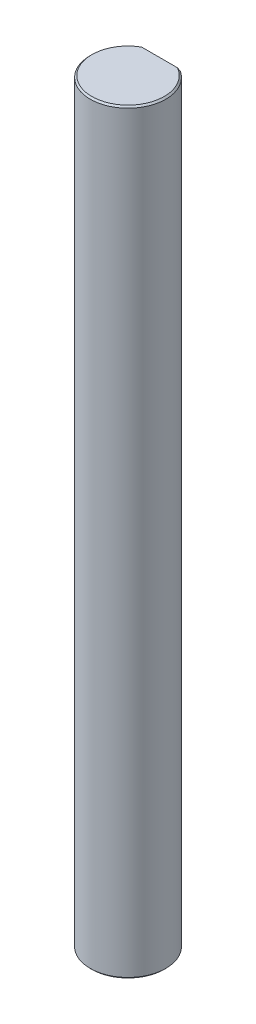
ISO-10303-21;
HEADER;
FILE_DESCRIPTION(('STEP AP214'),'2;1');
FILE_NAME('part.step','',(''),(''),'','','');
FILE_SCHEMA(('AUTOMOTIVE_DESIGN { 1 0 10303 214 1 1 1 1 }'));
ENDSEC;
DATA;
#1=APPLICATION_CONTEXT('core data for automotive mechanical design processes');
#2=APPLICATION_PROTOCOL_DEFINITION('international standard','automotive_design',2000,#1);
#3=PRODUCT_CONTEXT('',#1,'mechanical');
#4=PRODUCT('Part','Part','',(#3));
#5=PRODUCT_RELATED_PRODUCT_CATEGORY('part','',(#4));
#6=PRODUCT_DEFINITION_FORMATION('','',#4);
#7=PRODUCT_DEFINITION_CONTEXT('part definition',#1,'design');
#8=PRODUCT_DEFINITION('design','',#6,#7);
#9=PRODUCT_DEFINITION_SHAPE('','',#8);
#10=(LENGTH_UNIT() NAMED_UNIT(*) SI_UNIT(.MILLI.,.METRE.));
#11=(NAMED_UNIT(*) PLANE_ANGLE_UNIT() SI_UNIT($,.RADIAN.));
#12=(NAMED_UNIT(*) SI_UNIT($,.STERADIAN.) SOLID_ANGLE_UNIT());
#13=UNCERTAINTY_MEASURE_WITH_UNIT(LENGTH_MEASURE(1.E-05),#10,'distance_accuracy_value','');
#14=(GEOMETRIC_REPRESENTATION_CONTEXT(3) GLOBAL_UNCERTAINTY_ASSIGNED_CONTEXT((#13)) GLOBAL_UNIT_ASSIGNED_CONTEXT((#10,
#11,#12)) REPRESENTATION_CONTEXT('',''));
#15=CARTESIAN_POINT('',(0.,0.,0.));
#16=DIRECTION('',(0.,0.,1.));
#17=DIRECTION('',(1.,0.,0.));
#18=AXIS2_PLACEMENT_3D('',#15,#16,#17);
#19=CARTESIAN_POINT('',(0.,0.124999999999993,0.));
#20=DIRECTION('',(0.,1.,0.));
#21=DIRECTION('',(0.,0.,1.));
#22=AXIS2_PLACEMENT_3D('',#19,#20,#21);
#23=CONICAL_SURFACE('',#22,3.,0.785398163397438);
#24=CARTESIAN_POINT('',(0.,0.,0.));
#25=DIRECTION('',(0.,-1.,0.));
#26=DIRECTION('',(0.,0.,1.));
#27=AXIS2_PLACEMENT_3D('',#24,#25,#26);
#28=CIRCLE('',#27,2.875);
#29=CARTESIAN_POINT('',(0.,0.,2.875));
#30=VERTEX_POINT('',#29);
#31=CARTESIAN_POINT('',(-1.41972708645009,0.,-2.5));
#32=VERTEX_POINT('',#31);
#33=EDGE_CURVE('E41',#30,#32,#28,.T.);
#34=ORIENTED_EDGE('',*,*,#33,.F.);
#35=DIRECTION('',(0.,0.707106781186555,0.70710678118654));
#36=VECTOR('',#35,1.);
#37=CARTESIAN_POINT('',(0.,0.124999999999993,3.));
#38=LINE('',#37,#36);
#39=CARTESIAN_POINT('',(0.,0.124999999999993,3.));
#40=VERTEX_POINT('',#39);
#41=EDGE_CURVE('E10',#30,#40,#38,.T.);
#42=ORIENTED_EDGE('',*,*,#41,.T.);
#43=CARTESIAN_POINT('',(0.,0.124999999999993,0.));
#44=DIRECTION('',(0.,1.,0.));
#45=DIRECTION('',(0.,0.,1.));
#46=AXIS2_PLACEMENT_3D('',#43,#44,#45);
#47=CIRCLE('',#46,3.);
#48=CARTESIAN_POINT('',(-1.6583123951777,0.124999999999993,-2.5));
#49=VERTEX_POINT('',#48);
#50=EDGE_CURVE('E98',#49,#40,#47,.T.);
#51=ORIENTED_EDGE('',*,*,#50,.F.);
#52=CARTESIAN_POINT('',(-1.41972708645009,0.,-2.5));
#53=CARTESIAN_POINT('',(-1.5002290003424,0.0397533035352989,-2.5));
#54=CARTESIAN_POINT('',(-1.57973572193477,0.0815651095964495,-2.5));
#55=CARTESIAN_POINT('',(-1.6583123951777,0.124999999999993,-2.5));
#56=(BOUNDED_CURVE() B_SPLINE_CURVE(3,(#52,#53,#54,#55),.UNSPECIFIED.,.F.,
.F.) B_SPLINE_CURVE_WITH_KNOTS((4,4),(0.,0.000269347265701079),
.UNSPECIFIED.) CURVE() GEOMETRIC_REPRESENTATION_ITEM() RATIONAL_B_SPLINE_CURVE((1.,1.,1.,1.)) REPRESENTATION_ITEM(''));
#57=EDGE_CURVE('E87',#32,#49,#56,.T.);
#58=ORIENTED_EDGE('',*,*,#57,.F.);
#59=EDGE_LOOP('',(#34,#42,#51,#58));
#60=FACE_BOUND('',#59,.T.);
#61=ADVANCED_FACE('F16',(#60),#23,.T.);
#62=CARTESIAN_POINT('',(0.,60.,0.));
#63=DIRECTION('',(0.,-1.,0.));
#64=DIRECTION('',(0.,0.,-1.));
#65=AXIS2_PLACEMENT_3D('',#62,#63,#64);
#66=CYLINDRICAL_SURFACE('',#65,3.);
#67=DIRECTION('',(0.,-1.,0.));
#68=VECTOR('',#67,1.);
#69=CARTESIAN_POINT('',(-1.6583123951777,60.,-2.5));
#70=LINE('',#69,#68);
#71=CARTESIAN_POINT('',(-1.6583123951777,59.875,-2.5));
#72=VERTEX_POINT('',#71);
#73=EDGE_CURVE('E27',#72,#49,#70,.T.);
#74=ORIENTED_EDGE('',*,*,#73,.T.);
#75=ORIENTED_EDGE('',*,*,#50,.T.);
#76=CARTESIAN_POINT('',(0.,0.124999999999993,0.));
#77=DIRECTION('',(0.,1.,0.));
#78=DIRECTION('',(0.,0.,1.));
#79=AXIS2_PLACEMENT_3D('',#76,#77,#78);
#80=CIRCLE('',#79,3.);
#81=CARTESIAN_POINT('',(1.6583123951777,0.124999999999993,-2.5));
#82=VERTEX_POINT('',#81);
#83=EDGE_CURVE('E20',#40,#82,#80,.T.);
#84=ORIENTED_EDGE('',*,*,#83,.T.);
#85=DIRECTION('',(0.,-1.,0.));
#86=VECTOR('',#85,1.);
#87=CARTESIAN_POINT('',(1.6583123951777,60.,-2.5));
#88=LINE('',#87,#86);
#89=CARTESIAN_POINT('',(1.6583123951777,59.875,-2.5));
#90=VERTEX_POINT('',#89);
#91=EDGE_CURVE('E63',#90,#82,#88,.T.);
#92=ORIENTED_EDGE('',*,*,#91,.F.);
#93=CARTESIAN_POINT('',(0.,59.875,0.));
#94=DIRECTION('',(0.,-1.,0.));
#95=DIRECTION('',(0.,0.,1.));
#96=AXIS2_PLACEMENT_3D('',#93,#94,#95);
#97=CIRCLE('',#96,3.);
#98=EDGE_CURVE('E103',#90,#72,#97,.T.);
#99=ORIENTED_EDGE('',*,*,#98,.T.);
#100=EDGE_LOOP('',(#74,#75,#84,#92,#99));
#101=FACE_BOUND('',#100,.T.);
#102=ADVANCED_FACE('F102',(#101),#66,.T.);
#103=CARTESIAN_POINT('',(0.,60.,-2.5));
#104=DIRECTION('',(0.,0.,-1.));
#105=DIRECTION('',(0.,-1.,0.));
#106=AXIS2_PLACEMENT_3D('',#103,#104,#105);
#107=PLANE('',#106);
#108=ORIENTED_EDGE('',*,*,#91,.T.);
#109=CARTESIAN_POINT('',(1.6583123951777,0.124999999999993,-2.5));
#110=CARTESIAN_POINT('',(1.57973572193476,0.0815651095964618,-2.5));
#111=CARTESIAN_POINT('',(1.50022900034241,0.0397533035352747,-2.5));
#112=CARTESIAN_POINT('',(1.41972708645009,0.,-2.5));
#113=(BOUNDED_CURVE() B_SPLINE_CURVE(3,(#109,#110,#111,#112),.UNSPECIFIED.,.F.,
.F.) B_SPLINE_CURVE_WITH_KNOTS((4,4),(0.,0.00026934726570108),
.UNSPECIFIED.) CURVE() GEOMETRIC_REPRESENTATION_ITEM() RATIONAL_B_SPLINE_CURVE((1.,1.,1.,1.)) REPRESENTATION_ITEM(''));
#114=CARTESIAN_POINT('',(1.41972708645009,0.,-2.5));
#115=VERTEX_POINT('',#114);
#116=EDGE_CURVE('E95',#82,#115,#113,.T.);
#117=ORIENTED_EDGE('',*,*,#116,.T.);
#118=DIRECTION('',(1.,0.,0.));
#119=VECTOR('',#118,1.);
#120=CARTESIAN_POINT('',(0.,0.,-2.5));
#121=LINE('',#120,#119);
#122=EDGE_CURVE('E93',#32,#115,#121,.T.);
#123=ORIENTED_EDGE('',*,*,#122,.F.);
#124=ORIENTED_EDGE('',*,*,#57,.T.);
#125=ORIENTED_EDGE('',*,*,#73,.F.);
#126=CARTESIAN_POINT('',(-1.6583123951777,59.875,-2.5));
#127=CARTESIAN_POINT('',(-1.57973572193477,59.9184348904035,-2.5));
#128=CARTESIAN_POINT('',(-1.50022900034242,59.9602466964647,-2.5));
#129=CARTESIAN_POINT('',(-1.4197270864501,60.,-2.5));
#130=(BOUNDED_CURVE() B_SPLINE_CURVE(3,(#126,#127,#128,#129),.UNSPECIFIED.,.F.,
.F.) B_SPLINE_CURVE_WITH_KNOTS((4,4),(0.,0.000269347265701068),
.UNSPECIFIED.) CURVE() GEOMETRIC_REPRESENTATION_ITEM() RATIONAL_B_SPLINE_CURVE((1.,1.,1.,1.)) REPRESENTATION_ITEM(''));
#131=CARTESIAN_POINT('',(-1.4197270864501,60.,-2.5));
#132=VERTEX_POINT('',#131);
#133=EDGE_CURVE('E96',#72,#132,#130,.T.);
#134=ORIENTED_EDGE('',*,*,#133,.T.);
#135=DIRECTION('',(1.,0.,0.));
#136=VECTOR('',#135,1.);
#137=CARTESIAN_POINT('',(0.,60.,-2.5));
#138=LINE('',#137,#136);
#139=CARTESIAN_POINT('',(1.4197270864501,60.,-2.5));
#140=VERTEX_POINT('',#139);
#141=EDGE_CURVE('E115',#132,#140,#138,.T.);
#142=ORIENTED_EDGE('',*,*,#141,.T.);
#143=CARTESIAN_POINT('',(1.4197270864501,60.,-2.5));
#144=CARTESIAN_POINT('',(1.50022900034241,59.9602466964647,-2.5));
#145=CARTESIAN_POINT('',(1.57973572193477,59.9184348904036,-2.5));
#146=CARTESIAN_POINT('',(1.6583123951777,59.875,-2.5));
#147=(BOUNDED_CURVE() B_SPLINE_CURVE(3,(#143,#144,#145,#146),.UNSPECIFIED.,.F.,
.F.) B_SPLINE_CURVE_WITH_KNOTS((4,4),(0.,0.000269347265701068),
.UNSPECIFIED.) CURVE() GEOMETRIC_REPRESENTATION_ITEM() RATIONAL_B_SPLINE_CURVE((1.,1.,1.,1.)) REPRESENTATION_ITEM(''));
#148=EDGE_CURVE('E125',#140,#90,#147,.T.);
#149=ORIENTED_EDGE('',*,*,#148,.T.);
#150=EDGE_LOOP('',(#108,#117,#123,#124,#125,#134,#142,#149));
#151=FACE_BOUND('',#150,.T.);
#152=ADVANCED_FACE('F89',(#151),#107,.T.);
#153=CARTESIAN_POINT('',(0.,60.,0.));
#154=DIRECTION('',(0.,1.,0.));
#155=DIRECTION('',(1.,0.,0.));
#156=AXIS2_PLACEMENT_3D('',#153,#154,#155);
#157=PLANE('',#156);
#158=ORIENTED_EDGE('',*,*,#141,.F.);
#159=CARTESIAN_POINT('',(0.,60.,0.));
#160=DIRECTION('',(0.,1.,0.));
#161=DIRECTION('',(0.,0.,1.));
#162=AXIS2_PLACEMENT_3D('',#159,#160,#161);
#163=CIRCLE('',#162,2.875);
#164=EDGE_CURVE('E132',#132,#140,#163,.T.);
#165=ORIENTED_EDGE('',*,*,#164,.T.);
#166=EDGE_LOOP('',(#158,#165));
#167=FACE_BOUND('',#166,.T.);
#168=ADVANCED_FACE('F173',(#167),#157,.T.);
#169=CARTESIAN_POINT('',(0.,0.,0.));
#170=DIRECTION('',(0.,1.,0.));
#171=DIRECTION('',(1.,0.,0.));
#172=AXIS2_PLACEMENT_3D('',#169,#170,#171);
#173=PLANE('',#172);
#174=ORIENTED_EDGE('',*,*,#122,.T.);
#175=CARTESIAN_POINT('',(0.,0.,0.));
#176=DIRECTION('',(0.,-1.,0.));
#177=DIRECTION('',(0.,0.,1.));
#178=AXIS2_PLACEMENT_3D('',#175,#176,#177);
#179=CIRCLE('',#178,2.875);
#180=EDGE_CURVE('E111',#115,#30,#179,.T.);
#181=ORIENTED_EDGE('',*,*,#180,.T.);
#182=ORIENTED_EDGE('',*,*,#33,.T.);
#183=EDGE_LOOP('',(#174,#181,#182));
#184=FACE_BOUND('',#183,.T.);
#185=ADVANCED_FACE('F182',(#184),#173,.F.);
#186=CARTESIAN_POINT('',(0.,0.124999999999993,0.));
#187=DIRECTION('',(0.,1.,0.));
#188=DIRECTION('',(0.,0.,1.));
#189=AXIS2_PLACEMENT_3D('',#186,#187,#188);
#190=CONICAL_SURFACE('',#189,3.,0.785398163397438);
#191=ORIENTED_EDGE('',*,*,#41,.F.);
#192=ORIENTED_EDGE('',*,*,#180,.F.);
#193=ORIENTED_EDGE('',*,*,#116,.F.);
#194=ORIENTED_EDGE('',*,*,#83,.F.);
#195=EDGE_LOOP('',(#191,#192,#193,#194));
#196=FACE_BOUND('',#195,.T.);
#197=ADVANCED_FACE('F18',(#196),#190,.T.);
#198=CARTESIAN_POINT('',(0.,60.,0.));
#199=DIRECTION('',(0.,-1.,0.));
#200=DIRECTION('',(0.,0.,-1.));
#201=AXIS2_PLACEMENT_3D('',#198,#199,#200);
#202=CONICAL_SURFACE('',#201,2.875,0.785398163397412);
#203=ORIENTED_EDGE('',*,*,#133,.F.);
#204=ORIENTED_EDGE('',*,*,#98,.F.);
#205=ORIENTED_EDGE('',*,*,#148,.F.);
#206=ORIENTED_EDGE('',*,*,#164,.F.);
#207=EDGE_LOOP('',(#203,#204,#205,#206));
#208=FACE_BOUND('',#207,.T.);
#209=ADVANCED_FACE('F176',(#208),#202,.T.);
#210=CLOSED_SHELL('',(#61,#102,#152,#168,#185,#197,#209));
#211=MANIFOLD_SOLID_BREP('B1',#210);
#212=ADVANCED_BREP_SHAPE_REPRESENTATION('',(#18,#211),#14);
#213=SHAPE_DEFINITION_REPRESENTATION(#9,#212);
ENDSEC;
END-ISO-10303-21;
